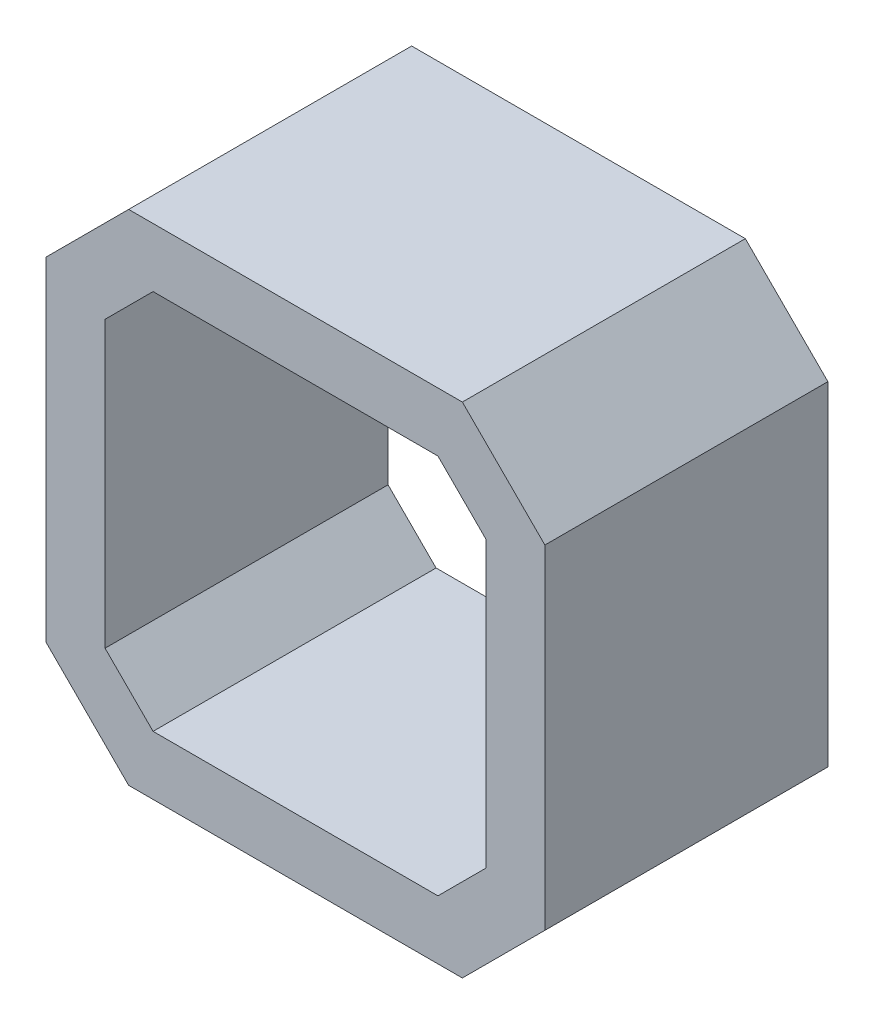
ISO-10303-21;
HEADER;
FILE_DESCRIPTION(('STEP AP214'),'2;1');
FILE_NAME('part.step','',(''),(''),'','','');
FILE_SCHEMA(('AUTOMOTIVE_DESIGN { 1 0 10303 214 1 1 1 1 }'));
ENDSEC;
DATA;
#1=APPLICATION_CONTEXT('core data for automotive mechanical design processes');
#2=APPLICATION_PROTOCOL_DEFINITION('international standard','automotive_design',2000,#1);
#3=PRODUCT_CONTEXT('',#1,'mechanical');
#4=PRODUCT('Part','Part','',(#3));
#5=PRODUCT_RELATED_PRODUCT_CATEGORY('part','',(#4));
#6=PRODUCT_DEFINITION_FORMATION('','',#4);
#7=PRODUCT_DEFINITION_CONTEXT('part definition',#1,'design');
#8=PRODUCT_DEFINITION('design','',#6,#7);
#9=PRODUCT_DEFINITION_SHAPE('','',#8);
#10=(LENGTH_UNIT() NAMED_UNIT(*) SI_UNIT(.MILLI.,.METRE.));
#11=(NAMED_UNIT(*) PLANE_ANGLE_UNIT() SI_UNIT($,.RADIAN.));
#12=(NAMED_UNIT(*) SI_UNIT($,.STERADIAN.) SOLID_ANGLE_UNIT());
#13=UNCERTAINTY_MEASURE_WITH_UNIT(LENGTH_MEASURE(1.E-05),#10,'distance_accuracy_value','');
#14=(GEOMETRIC_REPRESENTATION_CONTEXT(3) GLOBAL_UNCERTAINTY_ASSIGNED_CONTEXT((#13)) GLOBAL_UNIT_ASSIGNED_CONTEXT((#10,
#11,#12)) REPRESENTATION_CONTEXT('',''));
#15=CARTESIAN_POINT('',(0.,0.,0.));
#16=DIRECTION('',(0.,0.,1.));
#17=DIRECTION('',(1.,0.,0.));
#18=AXIS2_PLACEMENT_3D('',#15,#16,#17);
#19=CARTESIAN_POINT('',(0.,0.,24.));
#20=DIRECTION('',(0.,0.,-1.));
#21=DIRECTION('',(-1.,0.,0.));
#22=AXIS2_PLACEMENT_3D('',#19,#20,#21);
#23=PLANE('',#22);
#24=DIRECTION('',(-1.,0.,0.));
#25=VECTOR('',#24,1.);
#26=CARTESIAN_POINT('',(-14.15,21.15,24.));
#27=LINE('',#26,#25);
#28=CARTESIAN_POINT('',(14.15,21.15,24.));
#29=VERTEX_POINT('',#28);
#30=CARTESIAN_POINT('',(-14.15,21.15,24.));
#31=VERTEX_POINT('',#30);
#32=EDGE_CURVE('E242',#29,#31,#27,.T.);
#33=ORIENTED_EDGE('',*,*,#32,.T.);
#34=DIRECTION('',(-0.707106781186547,-0.707106781186547,0.));
#35=VECTOR('',#34,1.);
#36=CARTESIAN_POINT('',(-14.15,21.15,24.));
#37=LINE('',#36,#35);
#38=CARTESIAN_POINT('',(-21.15,14.15,24.));
#39=VERTEX_POINT('',#38);
#40=EDGE_CURVE('E246',#31,#39,#37,.T.);
#41=ORIENTED_EDGE('',*,*,#40,.T.);
#42=DIRECTION('',(0.,-1.,0.));
#43=VECTOR('',#42,1.);
#44=CARTESIAN_POINT('',(-21.15,14.15,24.));
#45=LINE('',#44,#43);
#46=CARTESIAN_POINT('',(-21.15,-14.15,24.));
#47=VERTEX_POINT('',#46);
#48=EDGE_CURVE('E250',#39,#47,#45,.T.);
#49=ORIENTED_EDGE('',*,*,#48,.T.);
#50=DIRECTION('',(0.707106781186547,-0.707106781186547,0.));
#51=VECTOR('',#50,1.);
#52=CARTESIAN_POINT('',(-21.15,-14.15,24.));
#53=LINE('',#52,#51);
#54=CARTESIAN_POINT('',(-14.15,-21.15,24.));
#55=VERTEX_POINT('',#54);
#56=EDGE_CURVE('E253',#47,#55,#53,.T.);
#57=ORIENTED_EDGE('',*,*,#56,.T.);
#58=DIRECTION('',(1.,0.,0.));
#59=VECTOR('',#58,1.);
#60=CARTESIAN_POINT('',(-14.15,-21.15,24.));
#61=LINE('',#60,#59);
#62=CARTESIAN_POINT('',(14.15,-21.15,24.));
#63=VERTEX_POINT('',#62);
#64=EDGE_CURVE('E256',#55,#63,#61,.T.);
#65=ORIENTED_EDGE('',*,*,#64,.T.);
#66=DIRECTION('',(0.707106781186547,0.707106781186548,0.));
#67=VECTOR('',#66,1.);
#68=CARTESIAN_POINT('',(21.15,-14.15,24.));
#69=LINE('',#68,#67);
#70=CARTESIAN_POINT('',(21.15,-14.15,24.));
#71=VERTEX_POINT('',#70);
#72=EDGE_CURVE('E259',#63,#71,#69,.T.);
#73=ORIENTED_EDGE('',*,*,#72,.T.);
#74=DIRECTION('',(0.,1.,0.));
#75=VECTOR('',#74,1.);
#76=CARTESIAN_POINT('',(21.15,14.15,24.));
#77=LINE('',#76,#75);
#78=CARTESIAN_POINT('',(21.15,14.15,24.));
#79=VERTEX_POINT('',#78);
#80=EDGE_CURVE('E262',#71,#79,#77,.T.);
#81=ORIENTED_EDGE('',*,*,#80,.T.);
#82=DIRECTION('',(-0.707106781186548,0.707106781186547,0.));
#83=VECTOR('',#82,1.);
#84=CARTESIAN_POINT('',(14.15,21.15,24.));
#85=LINE('',#84,#83);
#86=EDGE_CURVE('E265',#79,#29,#85,.T.);
#87=ORIENTED_EDGE('',*,*,#86,.T.);
#88=EDGE_LOOP('',(#33,#41,#49,#57,#65,#73,#81,#87));
#89=FACE_BOUND('',#88,.T.);
#90=DIRECTION('',(-0.707106781186547,-0.707106781186547,0.));
#91=VECTOR('',#90,1.);
#92=CARTESIAN_POINT('',(-12.0789321881345,16.15,24.));
#93=LINE('',#92,#91);
#94=CARTESIAN_POINT('',(-12.0789321881345,16.15,24.));
#95=VERTEX_POINT('',#94);
#96=CARTESIAN_POINT('',(-16.15,12.0789321881345,24.));
#97=VERTEX_POINT('',#96);
#98=EDGE_CURVE('E153',#95,#97,#93,.T.);
#99=ORIENTED_EDGE('',*,*,#98,.F.);
#100=DIRECTION('',(-1.,0.,0.));
#101=VECTOR('',#100,1.);
#102=CARTESIAN_POINT('',(-12.0789321881345,16.15,24.));
#103=LINE('',#102,#101);
#104=CARTESIAN_POINT('',(12.0789321881345,16.15,24.));
#105=VERTEX_POINT('',#104);
#106=EDGE_CURVE('E194',#105,#95,#103,.T.);
#107=ORIENTED_EDGE('',*,*,#106,.F.);
#108=DIRECTION('',(-0.707106781186547,0.707106781186547,0.));
#109=VECTOR('',#108,1.);
#110=CARTESIAN_POINT('',(12.0789321881345,16.15,24.));
#111=LINE('',#110,#109);
#112=CARTESIAN_POINT('',(16.15,12.0789321881345,24.));
#113=VERTEX_POINT('',#112);
#114=EDGE_CURVE('E191',#113,#105,#111,.T.);
#115=ORIENTED_EDGE('',*,*,#114,.F.);
#116=DIRECTION('',(0.,1.,0.));
#117=VECTOR('',#116,1.);
#118=CARTESIAN_POINT('',(16.15,12.0789321881345,24.));
#119=LINE('',#118,#117);
#120=CARTESIAN_POINT('',(16.15,-12.0789321881345,24.));
#121=VERTEX_POINT('',#120);
#122=EDGE_CURVE('E188',#121,#113,#119,.T.);
#123=ORIENTED_EDGE('',*,*,#122,.F.);
#124=DIRECTION('',(0.707106781186547,0.707106781186548,0.));
#125=VECTOR('',#124,1.);
#126=CARTESIAN_POINT('',(16.15,-12.0789321881345,24.));
#127=LINE('',#126,#125);
#128=CARTESIAN_POINT('',(12.0789321881345,-16.15,24.));
#129=VERTEX_POINT('',#128);
#130=EDGE_CURVE('E185',#129,#121,#127,.T.);
#131=ORIENTED_EDGE('',*,*,#130,.F.);
#132=DIRECTION('',(1.,0.,0.));
#133=VECTOR('',#132,1.);
#134=CARTESIAN_POINT('',(-12.0789321881345,-16.15,24.));
#135=LINE('',#134,#133);
#136=CARTESIAN_POINT('',(-12.0789321881345,-16.15,24.));
#137=VERTEX_POINT('',#136);
#138=EDGE_CURVE('E180',#137,#129,#135,.T.);
#139=ORIENTED_EDGE('',*,*,#138,.F.);
#140=DIRECTION('',(0.707106781186548,-0.707106781186547,0.));
#141=VECTOR('',#140,1.);
#142=CARTESIAN_POINT('',(-16.15,-12.0789321881345,24.));
#143=LINE('',#142,#141);
#144=CARTESIAN_POINT('',(-16.15,-12.0789321881345,24.));
#145=VERTEX_POINT('',#144);
#146=EDGE_CURVE('E176',#145,#137,#143,.T.);
#147=ORIENTED_EDGE('',*,*,#146,.F.);
#148=DIRECTION('',(0.,-1.,0.));
#149=VECTOR('',#148,1.);
#150=CARTESIAN_POINT('',(-16.15,12.0789321881345,24.));
#151=LINE('',#150,#149);
#152=EDGE_CURVE('E162',#97,#145,#151,.T.);
#153=ORIENTED_EDGE('',*,*,#152,.F.);
#154=EDGE_LOOP('',(#99,#107,#115,#123,#131,#139,#147,#153));
#155=FACE_BOUND('',#154,.T.);
#156=ADVANCED_FACE('F39',(#89,#155),#23,.F.);
#157=CARTESIAN_POINT('',(0.,0.,0.));
#158=DIRECTION('',(0.,0.,-1.));
#159=DIRECTION('',(-1.,0.,0.));
#160=AXIS2_PLACEMENT_3D('',#157,#158,#159);
#161=PLANE('',#160);
#162=DIRECTION('',(-1.,0.,0.));
#163=VECTOR('',#162,1.);
#164=CARTESIAN_POINT('',(-14.15,21.15,0.));
#165=LINE('',#164,#163);
#166=CARTESIAN_POINT('',(14.15,21.15,0.));
#167=VERTEX_POINT('',#166);
#168=CARTESIAN_POINT('',(-14.15,21.15,0.));
#169=VERTEX_POINT('',#168);
#170=EDGE_CURVE('E171',#167,#169,#165,.T.);
#171=ORIENTED_EDGE('',*,*,#170,.F.);
#172=DIRECTION('',(-0.707106781186548,0.707106781186547,0.));
#173=VECTOR('',#172,1.);
#174=CARTESIAN_POINT('',(14.15,21.15,0.));
#175=LINE('',#174,#173);
#176=CARTESIAN_POINT('',(21.15,14.15,0.));
#177=VERTEX_POINT('',#176);
#178=EDGE_CURVE('E247',#177,#167,#175,.T.);
#179=ORIENTED_EDGE('',*,*,#178,.F.);
#180=DIRECTION('',(0.,1.,0.));
#181=VECTOR('',#180,1.);
#182=CARTESIAN_POINT('',(21.15,14.15,0.));
#183=LINE('',#182,#181);
#184=CARTESIAN_POINT('',(21.15,-14.15,0.));
#185=VERTEX_POINT('',#184);
#186=EDGE_CURVE('E287',#185,#177,#183,.T.);
#187=ORIENTED_EDGE('',*,*,#186,.F.);
#188=DIRECTION('',(0.707106781186547,0.707106781186548,0.));
#189=VECTOR('',#188,1.);
#190=CARTESIAN_POINT('',(21.15,-14.15,0.));
#191=LINE('',#190,#189);
#192=CARTESIAN_POINT('',(14.15,-21.15,0.));
#193=VERTEX_POINT('',#192);
#194=EDGE_CURVE('E284',#193,#185,#191,.T.);
#195=ORIENTED_EDGE('',*,*,#194,.F.);
#196=DIRECTION('',(1.,0.,0.));
#197=VECTOR('',#196,1.);
#198=CARTESIAN_POINT('',(-14.15,-21.15,0.));
#199=LINE('',#198,#197);
#200=CARTESIAN_POINT('',(-14.15,-21.15,0.));
#201=VERTEX_POINT('',#200);
#202=EDGE_CURVE('E281',#201,#193,#199,.T.);
#203=ORIENTED_EDGE('',*,*,#202,.F.);
#204=DIRECTION('',(0.707106781186547,-0.707106781186547,0.));
#205=VECTOR('',#204,1.);
#206=CARTESIAN_POINT('',(-21.15,-14.15,0.));
#207=LINE('',#206,#205);
#208=CARTESIAN_POINT('',(-21.15,-14.15,0.));
#209=VERTEX_POINT('',#208);
#210=EDGE_CURVE('E278',#209,#201,#207,.T.);
#211=ORIENTED_EDGE('',*,*,#210,.F.);
#212=DIRECTION('',(0.,-1.,0.));
#213=VECTOR('',#212,1.);
#214=CARTESIAN_POINT('',(-21.15,14.15,0.));
#215=LINE('',#214,#213);
#216=CARTESIAN_POINT('',(-21.15,14.15,0.));
#217=VERTEX_POINT('',#216);
#218=EDGE_CURVE('E275',#217,#209,#215,.T.);
#219=ORIENTED_EDGE('',*,*,#218,.F.);
#220=DIRECTION('',(-0.707106781186547,-0.707106781186547,0.));
#221=VECTOR('',#220,1.);
#222=CARTESIAN_POINT('',(-14.15,21.15,0.));
#223=LINE('',#222,#221);
#224=EDGE_CURVE('E272',#169,#217,#223,.T.);
#225=ORIENTED_EDGE('',*,*,#224,.F.);
#226=EDGE_LOOP('',(#171,#179,#187,#195,#203,#211,#219,#225));
#227=FACE_BOUND('',#226,.T.);
#228=DIRECTION('',(-1.,0.,0.));
#229=VECTOR('',#228,1.);
#230=CARTESIAN_POINT('',(-12.0789321881345,16.15,0.));
#231=LINE('',#230,#229);
#232=CARTESIAN_POINT('',(12.0789321881345,16.15,0.));
#233=VERTEX_POINT('',#232);
#234=CARTESIAN_POINT('',(-12.0789321881345,16.15,0.));
#235=VERTEX_POINT('',#234);
#236=EDGE_CURVE('E163',#233,#235,#231,.T.);
#237=ORIENTED_EDGE('',*,*,#236,.T.);
#238=DIRECTION('',(-0.707106781186547,-0.707106781186547,0.));
#239=VECTOR('',#238,1.);
#240=CARTESIAN_POINT('',(-12.0789321881345,16.15,0.));
#241=LINE('',#240,#239);
#242=CARTESIAN_POINT('',(-16.15,12.0789321881345,0.));
#243=VERTEX_POINT('',#242);
#244=EDGE_CURVE('E63',#235,#243,#241,.T.);
#245=ORIENTED_EDGE('',*,*,#244,.T.);
#246=DIRECTION('',(0.,-1.,0.));
#247=VECTOR('',#246,1.);
#248=CARTESIAN_POINT('',(-16.15,12.0789321881345,0.));
#249=LINE('',#248,#247);
#250=CARTESIAN_POINT('',(-16.15,-12.0789321881345,0.));
#251=VERTEX_POINT('',#250);
#252=EDGE_CURVE('E169',#243,#251,#249,.T.);
#253=ORIENTED_EDGE('',*,*,#252,.T.);
#254=DIRECTION('',(0.707106781186548,-0.707106781186547,0.));
#255=VECTOR('',#254,1.);
#256=CARTESIAN_POINT('',(-16.15,-12.0789321881345,0.));
#257=LINE('',#256,#255);
#258=CARTESIAN_POINT('',(-12.0789321881345,-16.15,0.));
#259=VERTEX_POINT('',#258);
#260=EDGE_CURVE('E201',#251,#259,#257,.T.);
#261=ORIENTED_EDGE('',*,*,#260,.T.);
#262=DIRECTION('',(1.,0.,0.));
#263=VECTOR('',#262,1.);
#264=CARTESIAN_POINT('',(-12.0789321881345,-16.15,0.));
#265=LINE('',#264,#263);
#266=CARTESIAN_POINT('',(12.0789321881345,-16.15,0.));
#267=VERTEX_POINT('',#266);
#268=EDGE_CURVE('E205',#259,#267,#265,.T.);
#269=ORIENTED_EDGE('',*,*,#268,.T.);
#270=DIRECTION('',(0.707106781186547,0.707106781186548,0.));
#271=VECTOR('',#270,1.);
#272=CARTESIAN_POINT('',(16.15,-12.0789321881345,0.));
#273=LINE('',#272,#271);
#274=CARTESIAN_POINT('',(16.15,-12.0789321881345,0.));
#275=VERTEX_POINT('',#274);
#276=EDGE_CURVE('E209',#267,#275,#273,.T.);
#277=ORIENTED_EDGE('',*,*,#276,.T.);
#278=DIRECTION('',(0.,1.,0.));
#279=VECTOR('',#278,1.);
#280=CARTESIAN_POINT('',(16.15,12.0789321881345,0.));
#281=LINE('',#280,#279);
#282=CARTESIAN_POINT('',(16.15,12.0789321881345,0.));
#283=VERTEX_POINT('',#282);
#284=EDGE_CURVE('E213',#275,#283,#281,.T.);
#285=ORIENTED_EDGE('',*,*,#284,.T.);
#286=DIRECTION('',(-0.707106781186547,0.707106781186547,0.));
#287=VECTOR('',#286,1.);
#288=CARTESIAN_POINT('',(12.0789321881345,16.15,0.));
#289=LINE('',#288,#287);
#290=EDGE_CURVE('E217',#283,#233,#289,.T.);
#291=ORIENTED_EDGE('',*,*,#290,.T.);
#292=EDGE_LOOP('',(#237,#245,#253,#261,#269,#277,#285,#291));
#293=FACE_BOUND('',#292,.T.);
#294=ADVANCED_FACE('F326',(#227,#293),#161,.T.);
#295=CARTESIAN_POINT('',(-14.15,21.15,24.));
#296=DIRECTION('',(0.,-1.,0.));
#297=DIRECTION('',(0.,0.,-1.));
#298=AXIS2_PLACEMENT_3D('',#295,#296,#297);
#299=PLANE('',#298);
#300=ORIENTED_EDGE('',*,*,#170,.T.);
#301=DIRECTION('',(0.,0.,-1.));
#302=VECTOR('',#301,1.);
#303=CARTESIAN_POINT('',(-14.15,21.15,24.));
#304=LINE('',#303,#302);
#305=EDGE_CURVE('E11',#31,#169,#304,.T.);
#306=ORIENTED_EDGE('',*,*,#305,.F.);
#307=ORIENTED_EDGE('',*,*,#32,.F.);
#308=DIRECTION('',(0.,0.,-1.));
#309=VECTOR('',#308,1.);
#310=CARTESIAN_POINT('',(14.15,21.15,24.));
#311=LINE('',#310,#309);
#312=EDGE_CURVE('E268',#29,#167,#311,.T.);
#313=ORIENTED_EDGE('',*,*,#312,.T.);
#314=EDGE_LOOP('',(#300,#306,#307,#313));
#315=FACE_BOUND('',#314,.T.);
#316=ADVANCED_FACE('F41',(#315),#299,.F.);
#317=CARTESIAN_POINT('',(-14.15,21.15,24.));
#318=DIRECTION('',(0.707106781186548,-0.707106781186548,0.));
#319=DIRECTION('',(0.707106781186548,0.707106781186548,0.));
#320=AXIS2_PLACEMENT_3D('',#317,#318,#319);
#321=PLANE('',#320);
#322=ORIENTED_EDGE('',*,*,#224,.T.);
#323=DIRECTION('',(0.,0.,-1.));
#324=VECTOR('',#323,1.);
#325=CARTESIAN_POINT('',(-21.15,14.15,24.));
#326=LINE('',#325,#324);
#327=EDGE_CURVE('E48',#39,#217,#326,.T.);
#328=ORIENTED_EDGE('',*,*,#327,.F.);
#329=ORIENTED_EDGE('',*,*,#40,.F.);
#330=ORIENTED_EDGE('',*,*,#305,.T.);
#331=EDGE_LOOP('',(#322,#328,#329,#330));
#332=FACE_BOUND('',#331,.T.);
#333=ADVANCED_FACE('F343',(#332),#321,.F.);
#334=CARTESIAN_POINT('',(-21.15,14.15,24.));
#335=DIRECTION('',(1.,0.,0.));
#336=DIRECTION('',(0.,1.,0.));
#337=AXIS2_PLACEMENT_3D('',#334,#335,#336);
#338=PLANE('',#337);
#339=ORIENTED_EDGE('',*,*,#218,.T.);
#340=DIRECTION('',(0.,0.,-1.));
#341=VECTOR('',#340,1.);
#342=CARTESIAN_POINT('',(-21.15,-14.15,24.));
#343=LINE('',#342,#341);
#344=EDGE_CURVE('E311',#47,#209,#343,.T.);
#345=ORIENTED_EDGE('',*,*,#344,.F.);
#346=ORIENTED_EDGE('',*,*,#48,.F.);
#347=ORIENTED_EDGE('',*,*,#327,.T.);
#348=EDGE_LOOP('',(#339,#345,#346,#347));
#349=FACE_BOUND('',#348,.T.);
#350=ADVANCED_FACE('F320',(#349),#338,.F.);
#351=CARTESIAN_POINT('',(-21.15,-14.15,24.));
#352=DIRECTION('',(0.707106781186548,0.707106781186548,0.));
#353=DIRECTION('',(-0.707106781186548,0.707106781186548,0.));
#354=AXIS2_PLACEMENT_3D('',#351,#352,#353);
#355=PLANE('',#354);
#356=ORIENTED_EDGE('',*,*,#210,.T.);
#357=DIRECTION('',(0.,0.,-1.));
#358=VECTOR('',#357,1.);
#359=CARTESIAN_POINT('',(-14.15,-21.15,24.));
#360=LINE('',#359,#358);
#361=EDGE_CURVE('E307',#55,#201,#360,.T.);
#362=ORIENTED_EDGE('',*,*,#361,.F.);
#363=ORIENTED_EDGE('',*,*,#56,.F.);
#364=ORIENTED_EDGE('',*,*,#344,.T.);
#365=EDGE_LOOP('',(#356,#362,#363,#364));
#366=FACE_BOUND('',#365,.T.);
#367=ADVANCED_FACE('F332',(#366),#355,.F.);
#368=CARTESIAN_POINT('',(-14.15,-21.15,24.));
#369=DIRECTION('',(0.,1.,0.));
#370=DIRECTION('',(0.,0.,1.));
#371=AXIS2_PLACEMENT_3D('',#368,#369,#370);
#372=PLANE('',#371);
#373=ORIENTED_EDGE('',*,*,#202,.T.);
#374=DIRECTION('',(0.,0.,-1.));
#375=VECTOR('',#374,1.);
#376=CARTESIAN_POINT('',(14.15,-21.15,24.));
#377=LINE('',#376,#375);
#378=EDGE_CURVE('E303',#63,#193,#377,.T.);
#379=ORIENTED_EDGE('',*,*,#378,.F.);
#380=ORIENTED_EDGE('',*,*,#64,.F.);
#381=ORIENTED_EDGE('',*,*,#361,.T.);
#382=EDGE_LOOP('',(#373,#379,#380,#381));
#383=FACE_BOUND('',#382,.T.);
#384=ADVANCED_FACE('F336',(#383),#372,.F.);
#385=CARTESIAN_POINT('',(21.15,-14.15,24.));
#386=DIRECTION('',(-0.707106781186548,0.707106781186547,0.));
#387=DIRECTION('',(-0.707106781186547,-0.707106781186548,0.));
#388=AXIS2_PLACEMENT_3D('',#385,#386,#387);
#389=PLANE('',#388);
#390=ORIENTED_EDGE('',*,*,#194,.T.);
#391=DIRECTION('',(0.,0.,-1.));
#392=VECTOR('',#391,1.);
#393=CARTESIAN_POINT('',(21.15,-14.15,24.));
#394=LINE('',#393,#392);
#395=EDGE_CURVE('E299',#71,#185,#394,.T.);
#396=ORIENTED_EDGE('',*,*,#395,.F.);
#397=ORIENTED_EDGE('',*,*,#72,.F.);
#398=ORIENTED_EDGE('',*,*,#378,.T.);
#399=EDGE_LOOP('',(#390,#396,#397,#398));
#400=FACE_BOUND('',#399,.T.);
#401=ADVANCED_FACE('F356',(#400),#389,.F.);
#402=CARTESIAN_POINT('',(21.15,14.15,24.));
#403=DIRECTION('',(-1.,0.,0.));
#404=DIRECTION('',(0.,-1.,0.));
#405=AXIS2_PLACEMENT_3D('',#402,#403,#404);
#406=PLANE('',#405);
#407=ORIENTED_EDGE('',*,*,#186,.T.);
#408=DIRECTION('',(0.,0.,-1.));
#409=VECTOR('',#408,1.);
#410=CARTESIAN_POINT('',(21.15,14.15,24.));
#411=LINE('',#410,#409);
#412=EDGE_CURVE('E295',#79,#177,#411,.T.);
#413=ORIENTED_EDGE('',*,*,#412,.F.);
#414=ORIENTED_EDGE('',*,*,#80,.F.);
#415=ORIENTED_EDGE('',*,*,#395,.T.);
#416=EDGE_LOOP('',(#407,#413,#414,#415));
#417=FACE_BOUND('',#416,.T.);
#418=ADVANCED_FACE('F354',(#417),#406,.F.);
#419=CARTESIAN_POINT('',(14.15,21.15,24.));
#420=DIRECTION('',(-0.707106781186547,-0.707106781186548,0.));
#421=DIRECTION('',(0.707106781186548,-0.707106781186547,0.));
#422=AXIS2_PLACEMENT_3D('',#419,#420,#421);
#423=PLANE('',#422);
#424=ORIENTED_EDGE('',*,*,#178,.T.);
#425=ORIENTED_EDGE('',*,*,#312,.F.);
#426=ORIENTED_EDGE('',*,*,#86,.F.);
#427=ORIENTED_EDGE('',*,*,#412,.T.);
#428=EDGE_LOOP('',(#424,#425,#426,#427));
#429=FACE_BOUND('',#428,.T.);
#430=ADVANCED_FACE('F349',(#429),#423,.F.);
#431=CARTESIAN_POINT('',(-12.0789321881345,16.15,24.));
#432=DIRECTION('',(0.707106781186548,-0.707106781186548,0.));
#433=DIRECTION('',(0.707106781186548,0.707106781186548,0.));
#434=AXIS2_PLACEMENT_3D('',#431,#432,#433);
#435=PLANE('',#434);
#436=ORIENTED_EDGE('',*,*,#244,.F.);
#437=DIRECTION('',(0.,0.,-1.));
#438=VECTOR('',#437,1.);
#439=CARTESIAN_POINT('',(-12.0789321881345,16.15,24.));
#440=LINE('',#439,#438);
#441=EDGE_CURVE('E157',#95,#235,#440,.T.);
#442=ORIENTED_EDGE('',*,*,#441,.F.);
#443=ORIENTED_EDGE('',*,*,#98,.T.);
#444=DIRECTION('',(0.,0.,-1.));
#445=VECTOR('',#444,1.);
#446=CARTESIAN_POINT('',(-16.15,12.0789321881345,24.));
#447=LINE('',#446,#445);
#448=EDGE_CURVE('E156',#97,#243,#447,.T.);
#449=ORIENTED_EDGE('',*,*,#448,.T.);
#450=EDGE_LOOP('',(#436,#442,#443,#449));
#451=FACE_BOUND('',#450,.T.);
#452=ADVANCED_FACE('F155',(#451),#435,.T.);
#453=CARTESIAN_POINT('',(-16.15,12.0789321881345,24.));
#454=DIRECTION('',(1.,0.,0.));
#455=DIRECTION('',(0.,0.,-1.));
#456=AXIS2_PLACEMENT_3D('',#453,#454,#455);
#457=PLANE('',#456);
#458=ORIENTED_EDGE('',*,*,#252,.F.);
#459=ORIENTED_EDGE('',*,*,#448,.F.);
#460=ORIENTED_EDGE('',*,*,#152,.T.);
#461=DIRECTION('',(0.,0.,-1.));
#462=VECTOR('',#461,1.);
#463=CARTESIAN_POINT('',(-16.15,-12.0789321881345,24.));
#464=LINE('',#463,#462);
#465=EDGE_CURVE('E172',#145,#251,#464,.T.);
#466=ORIENTED_EDGE('',*,*,#465,.T.);
#467=EDGE_LOOP('',(#458,#459,#460,#466));
#468=FACE_BOUND('',#467,.T.);
#469=ADVANCED_FACE('F166',(#468),#457,.T.);
#470=CARTESIAN_POINT('',(-16.15,-12.0789321881345,24.));
#471=DIRECTION('',(0.707106781186547,0.707106781186548,0.));
#472=DIRECTION('',(-0.707106781186548,0.707106781186547,0.));
#473=AXIS2_PLACEMENT_3D('',#470,#471,#472);
#474=PLANE('',#473);
#475=ORIENTED_EDGE('',*,*,#260,.F.);
#476=ORIENTED_EDGE('',*,*,#465,.F.);
#477=ORIENTED_EDGE('',*,*,#146,.T.);
#478=DIRECTION('',(0.,0.,-1.));
#479=VECTOR('',#478,1.);
#480=CARTESIAN_POINT('',(-12.0789321881345,-16.15,24.));
#481=LINE('',#480,#479);
#482=EDGE_CURVE('E237',#137,#259,#481,.T.);
#483=ORIENTED_EDGE('',*,*,#482,.T.);
#484=EDGE_LOOP('',(#475,#476,#477,#483));
#485=FACE_BOUND('',#484,.T.);
#486=ADVANCED_FACE('F381',(#485),#474,.T.);
#487=CARTESIAN_POINT('',(-12.0789321881345,-16.15,24.));
#488=DIRECTION('',(0.,1.,0.));
#489=DIRECTION('',(0.,0.,1.));
#490=AXIS2_PLACEMENT_3D('',#487,#488,#489);
#491=PLANE('',#490);
#492=ORIENTED_EDGE('',*,*,#268,.F.);
#493=ORIENTED_EDGE('',*,*,#482,.F.);
#494=ORIENTED_EDGE('',*,*,#138,.T.);
#495=DIRECTION('',(0.,0.,-1.));
#496=VECTOR('',#495,1.);
#497=CARTESIAN_POINT('',(12.0789321881345,-16.15,24.));
#498=LINE('',#497,#496);
#499=EDGE_CURVE('E234',#129,#267,#498,.T.);
#500=ORIENTED_EDGE('',*,*,#499,.T.);
#501=EDGE_LOOP('',(#492,#493,#494,#500));
#502=FACE_BOUND('',#501,.T.);
#503=ADVANCED_FACE('F385',(#502),#491,.T.);
#504=CARTESIAN_POINT('',(16.15,-12.0789321881345,24.));
#505=DIRECTION('',(-0.707106781186548,0.707106781186547,0.));
#506=DIRECTION('',(-0.707106781186547,-0.707106781186548,0.));
#507=AXIS2_PLACEMENT_3D('',#504,#505,#506);
#508=PLANE('',#507);
#509=ORIENTED_EDGE('',*,*,#276,.F.);
#510=ORIENTED_EDGE('',*,*,#499,.F.);
#511=ORIENTED_EDGE('',*,*,#130,.T.);
#512=DIRECTION('',(0.,0.,-1.));
#513=VECTOR('',#512,1.);
#514=CARTESIAN_POINT('',(16.15,-12.0789321881345,24.));
#515=LINE('',#514,#513);
#516=EDGE_CURVE('E231',#121,#275,#515,.T.);
#517=ORIENTED_EDGE('',*,*,#516,.T.);
#518=EDGE_LOOP('',(#509,#510,#511,#517));
#519=FACE_BOUND('',#518,.T.);
#520=ADVANCED_FACE('F391',(#519),#508,.T.);
#521=CARTESIAN_POINT('',(16.15,12.0789321881345,24.));
#522=DIRECTION('',(-1.,0.,0.));
#523=DIRECTION('',(0.,0.,1.));
#524=AXIS2_PLACEMENT_3D('',#521,#522,#523);
#525=PLANE('',#524);
#526=ORIENTED_EDGE('',*,*,#284,.F.);
#527=ORIENTED_EDGE('',*,*,#516,.F.);
#528=ORIENTED_EDGE('',*,*,#122,.T.);
#529=DIRECTION('',(0.,0.,-1.));
#530=VECTOR('',#529,1.);
#531=CARTESIAN_POINT('',(16.15,12.0789321881345,24.));
#532=LINE('',#531,#530);
#533=EDGE_CURVE('E228',#113,#283,#532,.T.);
#534=ORIENTED_EDGE('',*,*,#533,.T.);
#535=EDGE_LOOP('',(#526,#527,#528,#534));
#536=FACE_BOUND('',#535,.T.);
#537=ADVANCED_FACE('F395',(#536),#525,.T.);
#538=CARTESIAN_POINT('',(12.0789321881345,16.15,24.));
#539=DIRECTION('',(-0.707106781186548,-0.707106781186548,0.));
#540=DIRECTION('',(0.707106781186548,-0.707106781186548,0.));
#541=AXIS2_PLACEMENT_3D('',#538,#539,#540);
#542=PLANE('',#541);
#543=ORIENTED_EDGE('',*,*,#290,.F.);
#544=ORIENTED_EDGE('',*,*,#533,.F.);
#545=ORIENTED_EDGE('',*,*,#114,.T.);
#546=DIRECTION('',(0.,0.,-1.));
#547=VECTOR('',#546,1.);
#548=CARTESIAN_POINT('',(12.0789321881345,16.15,24.));
#549=LINE('',#548,#547);
#550=EDGE_CURVE('E55',#105,#233,#549,.T.);
#551=ORIENTED_EDGE('',*,*,#550,.T.);
#552=EDGE_LOOP('',(#543,#544,#545,#551));
#553=FACE_BOUND('',#552,.T.);
#554=ADVANCED_FACE('F399',(#553),#542,.T.);
#555=CARTESIAN_POINT('',(-12.0789321881345,16.15,24.));
#556=DIRECTION('',(0.,-1.,0.));
#557=DIRECTION('',(0.,0.,-1.));
#558=AXIS2_PLACEMENT_3D('',#555,#556,#557);
#559=PLANE('',#558);
#560=ORIENTED_EDGE('',*,*,#236,.F.);
#561=ORIENTED_EDGE('',*,*,#550,.F.);
#562=ORIENTED_EDGE('',*,*,#106,.T.);
#563=ORIENTED_EDGE('',*,*,#441,.T.);
#564=EDGE_LOOP('',(#560,#561,#562,#563));
#565=FACE_BOUND('',#564,.T.);
#566=ADVANCED_FACE('F403',(#565),#559,.T.);
#567=CLOSED_SHELL('',(#156,#294,#316,#333,#350,#367,#384,#401,#418,#430,#452,#469,#486,#503,
#520,#537,#554,#566));
#568=MANIFOLD_SOLID_BREP('B2',#567);
#569=ADVANCED_BREP_SHAPE_REPRESENTATION('',(#18,#568),#14);
#570=SHAPE_DEFINITION_REPRESENTATION(#9,#569);
ENDSEC;
END-ISO-10303-21;
